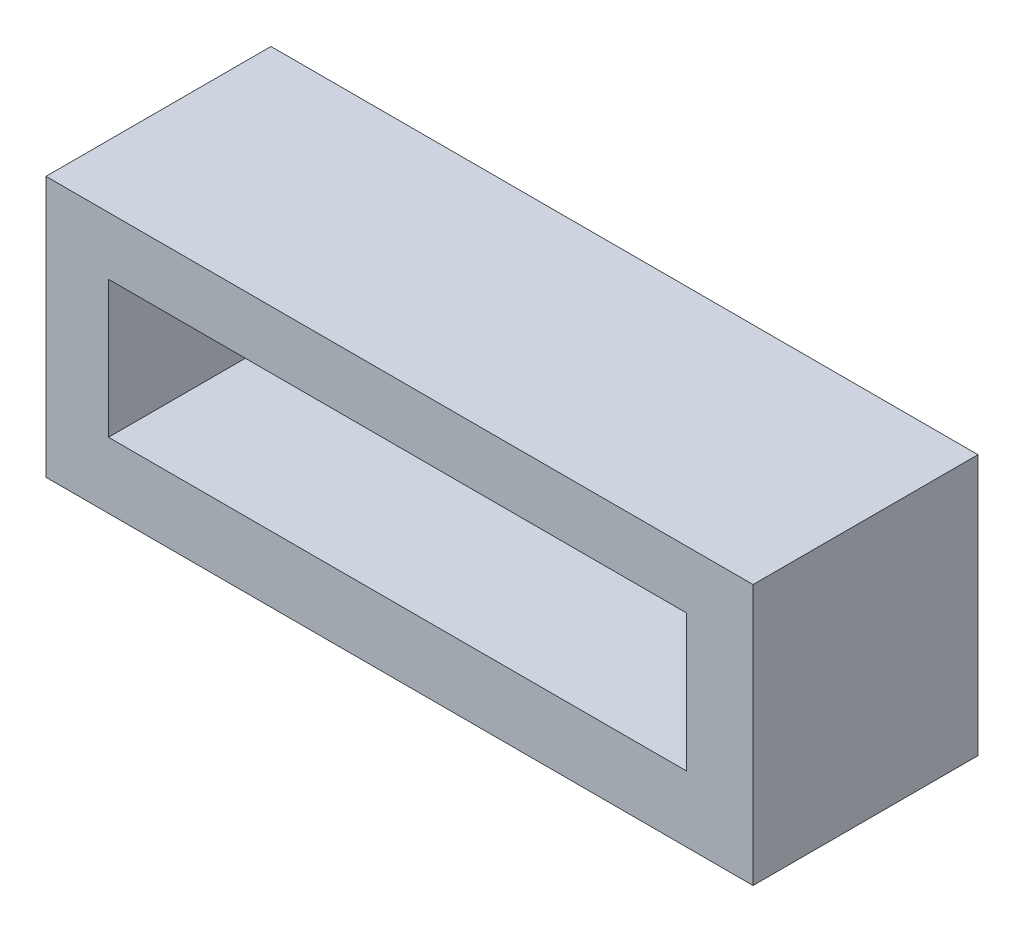
ISO-10303-21;
HEADER;
FILE_DESCRIPTION(('STEP AP214'),'2;1');
FILE_NAME('part.step','',(''),(''),'','','');
FILE_SCHEMA(('AUTOMOTIVE_DESIGN { 1 0 10303 214 1 1 1 1 }'));
ENDSEC;
DATA;
#1=APPLICATION_CONTEXT('core data for automotive mechanical design processes');
#2=APPLICATION_PROTOCOL_DEFINITION('international standard','automotive_design',2000,#1);
#3=PRODUCT_CONTEXT('',#1,'mechanical');
#4=PRODUCT('Part','Part','',(#3));
#5=PRODUCT_RELATED_PRODUCT_CATEGORY('part','',(#4));
#6=PRODUCT_DEFINITION_FORMATION('','',#4);
#7=PRODUCT_DEFINITION_CONTEXT('part definition',#1,'design');
#8=PRODUCT_DEFINITION('design','',#6,#7);
#9=PRODUCT_DEFINITION_SHAPE('','',#8);
#10=(LENGTH_UNIT() NAMED_UNIT(*) SI_UNIT(.MILLI.,.METRE.));
#11=(NAMED_UNIT(*) PLANE_ANGLE_UNIT() SI_UNIT($,.RADIAN.));
#12=(NAMED_UNIT(*) SI_UNIT($,.STERADIAN.) SOLID_ANGLE_UNIT());
#13=UNCERTAINTY_MEASURE_WITH_UNIT(LENGTH_MEASURE(1.E-05),#10,'distance_accuracy_value','');
#14=(GEOMETRIC_REPRESENTATION_CONTEXT(3) GLOBAL_UNCERTAINTY_ASSIGNED_CONTEXT((#13)) GLOBAL_UNIT_ASSIGNED_CONTEXT((#10,
#11,#12)) REPRESENTATION_CONTEXT('',''));
#15=CARTESIAN_POINT('',(0.,0.,0.));
#16=DIRECTION('',(0.,0.,1.));
#17=DIRECTION('',(1.,0.,0.));
#18=AXIS2_PLACEMENT_3D('',#15,#16,#17);
#19=CARTESIAN_POINT('',(-25.4581588686183,11.8636646884273,16.));
#20=DIRECTION('',(1.,0.,0.));
#21=DIRECTION('',(0.,1.,0.));
#22=AXIS2_PLACEMENT_3D('',#19,#20,#21);
#23=PLANE('',#22);
#24=DIRECTION('',(0.,-1.,0.));
#25=VECTOR('',#24,1.);
#26=CARTESIAN_POINT('',(-25.4581588686183,11.8636646884273,0.));
#27=LINE('',#26,#25);
#28=CARTESIAN_POINT('',(-25.4581588686183,11.8636646884273,0.));
#29=VERTEX_POINT('',#28);
#30=CARTESIAN_POINT('',(-25.4581588686183,-6.67633531157269,0.));
#31=VERTEX_POINT('',#30);
#32=EDGE_CURVE('E145',#29,#31,#27,.T.);
#33=ORIENTED_EDGE('',*,*,#32,.T.);
#34=DIRECTION('',(0.,0.,-1.));
#35=VECTOR('',#34,1.);
#36=CARTESIAN_POINT('',(-25.4581588686183,-6.67633531157269,16.));
#37=LINE('',#36,#35);
#38=CARTESIAN_POINT('',(-25.4581588686183,-6.67633531157269,16.));
#39=VERTEX_POINT('',#38);
#40=EDGE_CURVE('E11',#39,#31,#37,.T.);
#41=ORIENTED_EDGE('',*,*,#40,.F.);
#42=DIRECTION('',(0.,-1.,0.));
#43=VECTOR('',#42,1.);
#44=CARTESIAN_POINT('',(-25.4581588686183,11.8636646884273,16.));
#45=LINE('',#44,#43);
#46=CARTESIAN_POINT('',(-25.4581588686183,11.8636646884273,16.));
#47=VERTEX_POINT('',#46);
#48=EDGE_CURVE('E149',#47,#39,#45,.T.);
#49=ORIENTED_EDGE('',*,*,#48,.F.);
#50=DIRECTION('',(0.,0.,-1.));
#51=VECTOR('',#50,1.);
#52=CARTESIAN_POINT('',(-25.4581588686183,11.8636646884273,16.));
#53=LINE('',#52,#51);
#54=EDGE_CURVE('E155',#47,#29,#53,.T.);
#55=ORIENTED_EDGE('',*,*,#54,.T.);
#56=EDGE_LOOP('',(#33,#41,#49,#55));
#57=FACE_BOUND('',#56,.T.);
#58=ADVANCED_FACE('F37',(#57),#23,.F.);
#59=CARTESIAN_POINT('',(-25.4581588686183,-6.67633531157269,16.));
#60=DIRECTION('',(0.,1.,0.));
#61=DIRECTION('',(0.,0.,1.));
#62=AXIS2_PLACEMENT_3D('',#59,#60,#61);
#63=PLANE('',#62);
#64=DIRECTION('',(1.,0.,0.));
#65=VECTOR('',#64,1.);
#66=CARTESIAN_POINT('',(-25.4581588686183,-6.67633531157269,0.));
#67=LINE('',#66,#65);
#68=CARTESIAN_POINT('',(24.8318411313817,-6.67633531157269,0.));
#69=VERTEX_POINT('',#68);
#70=EDGE_CURVE('E158',#31,#69,#67,.T.);
#71=ORIENTED_EDGE('',*,*,#70,.T.);
#72=DIRECTION('',(0.,0.,-1.));
#73=VECTOR('',#72,1.);
#74=CARTESIAN_POINT('',(24.8318411313817,-6.67633531157269,16.));
#75=LINE('',#74,#73);
#76=CARTESIAN_POINT('',(24.8318411313817,-6.67633531157269,16.));
#77=VERTEX_POINT('',#76);
#78=EDGE_CURVE('E44',#77,#69,#75,.T.);
#79=ORIENTED_EDGE('',*,*,#78,.F.);
#80=DIRECTION('',(1.,0.,0.));
#81=VECTOR('',#80,1.);
#82=CARTESIAN_POINT('',(-25.4581588686183,-6.67633531157269,16.));
#83=LINE('',#82,#81);
#84=EDGE_CURVE('E88',#39,#77,#83,.T.);
#85=ORIENTED_EDGE('',*,*,#84,.F.);
#86=ORIENTED_EDGE('',*,*,#40,.T.);
#87=EDGE_LOOP('',(#71,#79,#85,#86));
#88=FACE_BOUND('',#87,.T.);
#89=ADVANCED_FACE('F187',(#88),#63,.F.);
#90=CARTESIAN_POINT('',(24.8318411313817,11.8636646884273,16.));
#91=DIRECTION('',(-1.,0.,0.));
#92=DIRECTION('',(0.,0.,1.));
#93=AXIS2_PLACEMENT_3D('',#90,#91,#92);
#94=PLANE('',#93);
#95=DIRECTION('',(0.,1.,0.));
#96=VECTOR('',#95,1.);
#97=CARTESIAN_POINT('',(24.8318411313817,11.8636646884273,0.));
#98=LINE('',#97,#96);
#99=CARTESIAN_POINT('',(24.8318411313817,11.8636646884273,0.));
#100=VERTEX_POINT('',#99);
#101=EDGE_CURVE('E160',#69,#100,#98,.T.);
#102=ORIENTED_EDGE('',*,*,#101,.T.);
#103=DIRECTION('',(0.,0.,-1.));
#104=VECTOR('',#103,1.);
#105=CARTESIAN_POINT('',(24.8318411313817,11.8636646884273,16.));
#106=LINE('',#105,#104);
#107=CARTESIAN_POINT('',(24.8318411313817,11.8636646884273,16.));
#108=VERTEX_POINT('',#107);
#109=EDGE_CURVE('E164',#108,#100,#106,.T.);
#110=ORIENTED_EDGE('',*,*,#109,.F.);
#111=DIRECTION('',(0.,1.,0.));
#112=VECTOR('',#111,1.);
#113=CARTESIAN_POINT('',(24.8318411313817,11.8636646884273,16.));
#114=LINE('',#113,#112);
#115=EDGE_CURVE('E152',#77,#108,#114,.T.);
#116=ORIENTED_EDGE('',*,*,#115,.F.);
#117=ORIENTED_EDGE('',*,*,#78,.T.);
#118=EDGE_LOOP('',(#102,#110,#116,#117));
#119=FACE_BOUND('',#118,.T.);
#120=ADVANCED_FACE('F169',(#119),#94,.F.);
#121=CARTESIAN_POINT('',(-25.4581588686183,11.8636646884273,16.));
#122=DIRECTION('',(0.,-1.,0.));
#123=DIRECTION('',(0.,0.,-1.));
#124=AXIS2_PLACEMENT_3D('',#121,#122,#123);
#125=PLANE('',#124);
#126=DIRECTION('',(-1.,0.,0.));
#127=VECTOR('',#126,1.);
#128=CARTESIAN_POINT('',(-25.4581588686183,11.8636646884273,0.));
#129=LINE('',#128,#127);
#130=EDGE_CURVE('E81',#100,#29,#129,.T.);
#131=ORIENTED_EDGE('',*,*,#130,.T.);
#132=ORIENTED_EDGE('',*,*,#54,.F.);
#133=DIRECTION('',(-1.,0.,0.));
#134=VECTOR('',#133,1.);
#135=CARTESIAN_POINT('',(-25.4581588686183,11.8636646884273,16.));
#136=LINE('',#135,#134);
#137=EDGE_CURVE('E60',#108,#47,#136,.T.);
#138=ORIENTED_EDGE('',*,*,#137,.F.);
#139=ORIENTED_EDGE('',*,*,#109,.T.);
#140=EDGE_LOOP('',(#131,#132,#138,#139));
#141=FACE_BOUND('',#140,.T.);
#142=ADVANCED_FACE('F177',(#141),#125,.F.);
#143=CARTESIAN_POINT('',(0.,0.,16.));
#144=DIRECTION('',(0.,0.,1.));
#145=DIRECTION('',(1.,0.,0.));
#146=AXIS2_PLACEMENT_3D('',#143,#144,#145);
#147=PLANE('',#146);
#148=DIRECTION('',(0.,-1.,0.));
#149=VECTOR('',#148,1.);
#150=CARTESIAN_POINT('',(-21.0124399191566,7.74701266781449,16.));
#151=LINE('',#150,#149);
#152=CARTESIAN_POINT('',(-21.0124399191566,7.74701266781449,16.));
#153=VERTEX_POINT('',#152);
#154=CARTESIAN_POINT('',(-21.0124399191566,-1.98708907102785,16.));
#155=VERTEX_POINT('',#154);
#156=EDGE_CURVE('E51',#153,#155,#151,.T.);
#157=ORIENTED_EDGE('',*,*,#156,.F.);
#158=DIRECTION('',(-1.,0.,0.));
#159=VECTOR('',#158,1.);
#160=CARTESIAN_POINT('',(-21.0124399191566,7.74701266781449,16.));
#161=LINE('',#160,#159);
#162=CARTESIAN_POINT('',(20.099825071954,7.74701266781449,16.));
#163=VERTEX_POINT('',#162);
#164=EDGE_CURVE('E130',#163,#153,#161,.T.);
#165=ORIENTED_EDGE('',*,*,#164,.F.);
#166=DIRECTION('',(0.,1.,0.));
#167=VECTOR('',#166,1.);
#168=CARTESIAN_POINT('',(20.099825071954,7.74701266781449,16.));
#169=LINE('',#168,#167);
#170=CARTESIAN_POINT('',(20.099825071954,-1.98708907102785,16.));
#171=VERTEX_POINT('',#170);
#172=EDGE_CURVE('E133',#171,#163,#169,.T.);
#173=ORIENTED_EDGE('',*,*,#172,.F.);
#174=DIRECTION('',(1.,0.,0.));
#175=VECTOR('',#174,1.);
#176=CARTESIAN_POINT('',(-21.0124399191566,-1.98708907102785,16.));
#177=LINE('',#176,#175);
#178=EDGE_CURVE('E139',#155,#171,#177,.T.);
#179=ORIENTED_EDGE('',*,*,#178,.F.);
#180=EDGE_LOOP('',(#157,#165,#173,#179));
#181=FACE_BOUND('',#180,.T.);
#182=ORIENTED_EDGE('',*,*,#48,.T.);
#183=ORIENTED_EDGE('',*,*,#84,.T.);
#184=ORIENTED_EDGE('',*,*,#115,.T.);
#185=ORIENTED_EDGE('',*,*,#137,.T.);
#186=EDGE_LOOP('',(#182,#183,#184,#185));
#187=FACE_BOUND('',#186,.T.);
#188=ADVANCED_FACE('F179',(#181,#187),#147,.T.);
#189=CARTESIAN_POINT('',(0.,0.,0.));
#190=DIRECTION('',(0.,0.,1.));
#191=DIRECTION('',(1.,0.,0.));
#192=AXIS2_PLACEMENT_3D('',#189,#190,#191);
#193=PLANE('',#192);
#194=ORIENTED_EDGE('',*,*,#32,.F.);
#195=ORIENTED_EDGE('',*,*,#130,.F.);
#196=ORIENTED_EDGE('',*,*,#101,.F.);
#197=ORIENTED_EDGE('',*,*,#70,.F.);
#198=EDGE_LOOP('',(#194,#195,#196,#197));
#199=FACE_BOUND('',#198,.T.);
#200=ADVANCED_FACE('F173',(#199),#193,.F.);
#201=CARTESIAN_POINT('',(-21.0124399191566,7.74701266781449,6.));
#202=DIRECTION('',(-1.,0.,0.));
#203=DIRECTION('',(0.,0.,1.));
#204=AXIS2_PLACEMENT_3D('',#201,#202,#203);
#205=PLANE('',#204);
#206=ORIENTED_EDGE('',*,*,#156,.T.);
#207=DIRECTION('',(0.,0.,1.));
#208=VECTOR('',#207,1.);
#209=CARTESIAN_POINT('',(-21.0124399191566,-1.98708907102785,6.));
#210=LINE('',#209,#208);
#211=CARTESIAN_POINT('',(-21.0124399191566,-1.98708907102785,6.));
#212=VERTEX_POINT('',#211);
#213=EDGE_CURVE('E108',#212,#155,#210,.T.);
#214=ORIENTED_EDGE('',*,*,#213,.F.);
#215=DIRECTION('',(0.,-1.,0.));
#216=VECTOR('',#215,1.);
#217=CARTESIAN_POINT('',(-21.0124399191566,7.74701266781449,6.));
#218=LINE('',#217,#216);
#219=CARTESIAN_POINT('',(-21.0124399191566,7.74701266781449,6.));
#220=VERTEX_POINT('',#219);
#221=EDGE_CURVE('E112',#220,#212,#218,.T.);
#222=ORIENTED_EDGE('',*,*,#221,.F.);
#223=DIRECTION('',(0.,0.,1.));
#224=VECTOR('',#223,1.);
#225=CARTESIAN_POINT('',(-21.0124399191566,7.74701266781449,6.));
#226=LINE('',#225,#224);
#227=EDGE_CURVE('E143',#220,#153,#226,.T.);
#228=ORIENTED_EDGE('',*,*,#227,.T.);
#229=EDGE_LOOP('',(#206,#214,#222,#228));
#230=FACE_BOUND('',#229,.T.);
#231=ADVANCED_FACE('F110',(#230),#205,.F.);
#232=CARTESIAN_POINT('',(-21.0124399191566,7.74701266781449,6.));
#233=DIRECTION('',(0.,1.,0.));
#234=DIRECTION('',(0.,0.,1.));
#235=AXIS2_PLACEMENT_3D('',#232,#233,#234);
#236=PLANE('',#235);
#237=ORIENTED_EDGE('',*,*,#164,.T.);
#238=ORIENTED_EDGE('',*,*,#227,.F.);
#239=DIRECTION('',(-1.,0.,0.));
#240=VECTOR('',#239,1.);
#241=CARTESIAN_POINT('',(-21.0124399191566,7.74701266781449,6.));
#242=LINE('',#241,#240);
#243=CARTESIAN_POINT('',(20.099825071954,7.74701266781449,6.));
#244=VERTEX_POINT('',#243);
#245=EDGE_CURVE('E118',#244,#220,#242,.T.);
#246=ORIENTED_EDGE('',*,*,#245,.F.);
#247=DIRECTION('',(0.,0.,1.));
#248=VECTOR('',#247,1.);
#249=CARTESIAN_POINT('',(20.099825071954,7.74701266781449,6.));
#250=LINE('',#249,#248);
#251=EDGE_CURVE('E146',#244,#163,#250,.T.);
#252=ORIENTED_EDGE('',*,*,#251,.T.);
#253=EDGE_LOOP('',(#237,#238,#246,#252));
#254=FACE_BOUND('',#253,.T.);
#255=ADVANCED_FACE('F226',(#254),#236,.F.);
#256=CARTESIAN_POINT('',(20.099825071954,7.74701266781449,6.));
#257=DIRECTION('',(1.,0.,0.));
#258=DIRECTION('',(0.,0.,-1.));
#259=AXIS2_PLACEMENT_3D('',#256,#257,#258);
#260=PLANE('',#259);
#261=ORIENTED_EDGE('',*,*,#172,.T.);
#262=ORIENTED_EDGE('',*,*,#251,.F.);
#263=DIRECTION('',(0.,1.,0.));
#264=VECTOR('',#263,1.);
#265=CARTESIAN_POINT('',(20.099825071954,7.74701266781449,6.));
#266=LINE('',#265,#264);
#267=CARTESIAN_POINT('',(20.099825071954,-1.98708907102785,6.));
#268=VERTEX_POINT('',#267);
#269=EDGE_CURVE('E126',#268,#244,#266,.T.);
#270=ORIENTED_EDGE('',*,*,#269,.F.);
#271=DIRECTION('',(0.,0.,1.));
#272=VECTOR('',#271,1.);
#273=CARTESIAN_POINT('',(20.099825071954,-1.98708907102785,6.));
#274=LINE('',#273,#272);
#275=EDGE_CURVE('E117',#268,#171,#274,.T.);
#276=ORIENTED_EDGE('',*,*,#275,.T.);
#277=EDGE_LOOP('',(#261,#262,#270,#276));
#278=FACE_BOUND('',#277,.T.);
#279=ADVANCED_FACE('F235',(#278),#260,.F.);
#280=CARTESIAN_POINT('',(-21.0124399191566,-1.98708907102785,6.));
#281=DIRECTION('',(0.,-1.,0.));
#282=DIRECTION('',(0.,0.,-1.));
#283=AXIS2_PLACEMENT_3D('',#280,#281,#282);
#284=PLANE('',#283);
#285=ORIENTED_EDGE('',*,*,#178,.T.);
#286=ORIENTED_EDGE('',*,*,#275,.F.);
#287=DIRECTION('',(1.,0.,0.));
#288=VECTOR('',#287,1.);
#289=CARTESIAN_POINT('',(-21.0124399191566,-1.98708907102785,6.));
#290=LINE('',#289,#288);
#291=EDGE_CURVE('E121',#212,#268,#290,.T.);
#292=ORIENTED_EDGE('',*,*,#291,.F.);
#293=ORIENTED_EDGE('',*,*,#213,.T.);
#294=EDGE_LOOP('',(#285,#286,#292,#293));
#295=FACE_BOUND('',#294,.T.);
#296=ADVANCED_FACE('F122',(#295),#284,.F.);
#297=CARTESIAN_POINT('',(0.,0.,6.));
#298=DIRECTION('',(0.,0.,1.));
#299=DIRECTION('',(1.,0.,0.));
#300=AXIS2_PLACEMENT_3D('',#297,#298,#299);
#301=PLANE('',#300);
#302=ORIENTED_EDGE('',*,*,#221,.T.);
#303=ORIENTED_EDGE('',*,*,#291,.T.);
#304=ORIENTED_EDGE('',*,*,#269,.T.);
#305=ORIENTED_EDGE('',*,*,#245,.T.);
#306=EDGE_LOOP('',(#302,#303,#304,#305));
#307=FACE_BOUND('',#306,.T.);
#308=ADVANCED_FACE('F128',(#307),#301,.T.);
#309=CLOSED_SHELL('',(#58,#89,#120,#142,#188,#200,#231,#255,#279,#296,#308));
#310=MANIFOLD_SOLID_BREP('B2',#309);
#311=ADVANCED_BREP_SHAPE_REPRESENTATION('',(#18,#310),#14);
#312=SHAPE_DEFINITION_REPRESENTATION(#9,#311);
ENDSEC;
END-ISO-10303-21;
